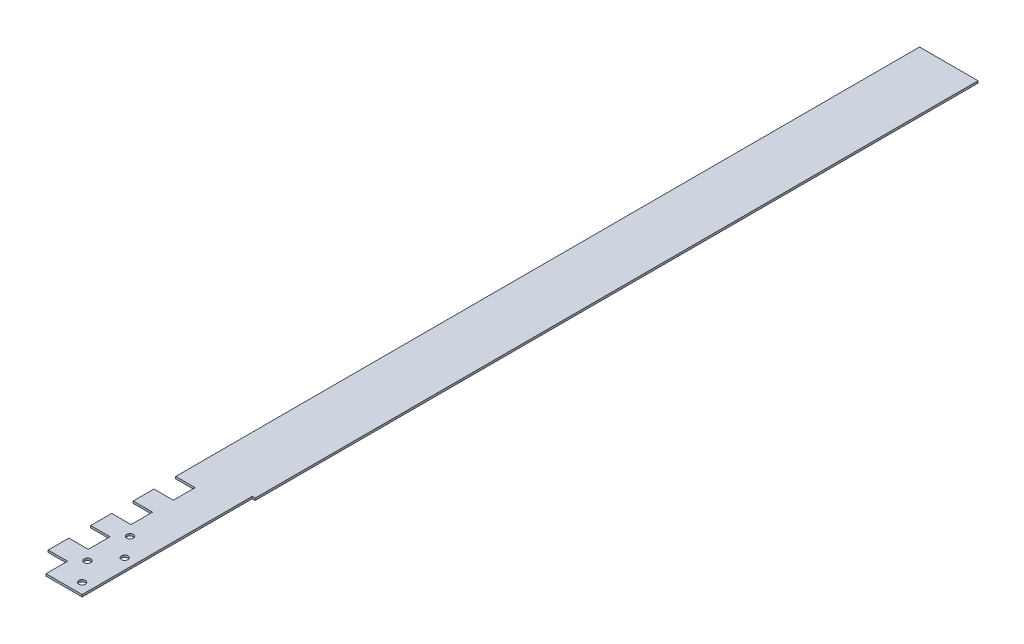
ISO-10303-21;
HEADER;
FILE_DESCRIPTION(('STEP AP214'),'2;1');
FILE_NAME('part.step','',(''),(''),'','','');
FILE_SCHEMA(('AUTOMOTIVE_DESIGN { 1 0 10303 214 1 1 1 1 }'));
ENDSEC;
DATA;
#1=APPLICATION_CONTEXT('core data for automotive mechanical design processes');
#2=APPLICATION_PROTOCOL_DEFINITION('international standard','automotive_design',2000,#1);
#3=PRODUCT_CONTEXT('',#1,'mechanical');
#4=PRODUCT('Part','Part','',(#3));
#5=PRODUCT_RELATED_PRODUCT_CATEGORY('part','',(#4));
#6=PRODUCT_DEFINITION_FORMATION('','',#4);
#7=PRODUCT_DEFINITION_CONTEXT('part definition',#1,'design');
#8=PRODUCT_DEFINITION('design','',#6,#7);
#9=PRODUCT_DEFINITION_SHAPE('','',#8);
#10=(LENGTH_UNIT() NAMED_UNIT(*) SI_UNIT(.MILLI.,.METRE.));
#11=(NAMED_UNIT(*) PLANE_ANGLE_UNIT() SI_UNIT($,.RADIAN.));
#12=(NAMED_UNIT(*) SI_UNIT($,.STERADIAN.) SOLID_ANGLE_UNIT());
#13=UNCERTAINTY_MEASURE_WITH_UNIT(LENGTH_MEASURE(1.E-05),#10,'distance_accuracy_value','');
#14=(GEOMETRIC_REPRESENTATION_CONTEXT(3) GLOBAL_UNCERTAINTY_ASSIGNED_CONTEXT((#13)) GLOBAL_UNIT_ASSIGNED_CONTEXT((#10,
#11,#12)) REPRESENTATION_CONTEXT('',''));
#15=CARTESIAN_POINT('',(0.,0.,0.));
#16=DIRECTION('',(0.,0.,1.));
#17=DIRECTION('',(1.,0.,0.));
#18=AXIS2_PLACEMENT_3D('',#15,#16,#17);
#19=CARTESIAN_POINT('',(-0.280000000000004,-0.999999999999995,170.));
#20=DIRECTION('',(0.,1.,0.));
#21=DIRECTION('',(-1.,0.,0.));
#22=AXIS2_PLACEMENT_3D('',#19,#20,#21);
#23=CYLINDRICAL_SURFACE('',#22,3.09999999999999);
#24=CARTESIAN_POINT('',(-0.280000000000004,-0.999999999999995,170.));
#25=DIRECTION('',(0.,1.,0.));
#26=DIRECTION('',(-1.,0.,0.));
#27=AXIS2_PLACEMENT_3D('',#24,#25,#26);
#28=CIRCLE('',#27,3.09999999999999);
#29=CARTESIAN_POINT('',(-3.37999999999999,-0.999999999999996,170.));
#30=VERTEX_POINT('',#29);
#31=EDGE_CURVE('E274',#30,#30,#28,.T.);
#32=ORIENTED_EDGE('',*,*,#31,.F.);
#33=EDGE_LOOP('',(#32));
#34=FACE_BOUND('',#33,.T.);
#35=CARTESIAN_POINT('',(-0.280000000000005,1.00000000000001,170.));
#36=DIRECTION('',(0.,1.,0.));
#37=DIRECTION('',(-1.,0.,0.));
#38=AXIS2_PLACEMENT_3D('',#35,#36,#37);
#39=CIRCLE('',#38,3.09999999999999);
#40=CARTESIAN_POINT('',(-3.37999999999999,1.,170.));
#41=VERTEX_POINT('',#40);
#42=EDGE_CURVE('E61',#41,#41,#39,.T.);
#43=ORIENTED_EDGE('',*,*,#42,.T.);
#44=EDGE_LOOP('',(#43));
#45=FACE_BOUND('',#44,.T.);
#46=ADVANCED_FACE('F57',(#34,#45),#23,.F.);
#47=CARTESIAN_POINT('',(14.72,-0.999999999999992,190.));
#48=DIRECTION('',(0.,1.,0.));
#49=DIRECTION('',(-1.,0.,0.));
#50=AXIS2_PLACEMENT_3D('',#47,#48,#49);
#51=CYLINDRICAL_SURFACE('',#50,3.09999999999999);
#52=CARTESIAN_POINT('',(14.72,-0.999999999999992,190.));
#53=DIRECTION('',(0.,1.,0.));
#54=DIRECTION('',(-1.,0.,0.));
#55=AXIS2_PLACEMENT_3D('',#52,#53,#54);
#56=CIRCLE('',#55,3.09999999999999);
#57=CARTESIAN_POINT('',(11.62,-0.999999999999993,190.));
#58=VERTEX_POINT('',#57);
#59=EDGE_CURVE('E277',#58,#58,#56,.T.);
#60=ORIENTED_EDGE('',*,*,#59,.F.);
#61=EDGE_LOOP('',(#60));
#62=FACE_BOUND('',#61,.T.);
#63=CARTESIAN_POINT('',(14.72,1.00000000000001,190.));
#64=DIRECTION('',(0.,1.,0.));
#65=DIRECTION('',(-1.,0.,0.));
#66=AXIS2_PLACEMENT_3D('',#63,#64,#65);
#67=CIRCLE('',#66,3.09999999999999);
#68=CARTESIAN_POINT('',(11.62,1.00000000000001,190.));
#69=VERTEX_POINT('',#68);
#70=EDGE_CURVE('E364',#69,#69,#67,.T.);
#71=ORIENTED_EDGE('',*,*,#70,.T.);
#72=EDGE_LOOP('',(#71));
#73=FACE_BOUND('',#72,.T.);
#74=ADVANCED_FACE('F431',(#62,#73),#51,.F.);
#75=CARTESIAN_POINT('',(-0.280000000000006,-0.999999999999995,210.));
#76=DIRECTION('',(0.,1.,0.));
#77=DIRECTION('',(-1.,0.,0.));
#78=AXIS2_PLACEMENT_3D('',#75,#76,#77);
#79=CYLINDRICAL_SURFACE('',#78,3.09999999999999);
#80=CARTESIAN_POINT('',(-0.280000000000006,-0.999999999999995,210.));
#81=DIRECTION('',(0.,1.,0.));
#82=DIRECTION('',(-1.,0.,0.));
#83=AXIS2_PLACEMENT_3D('',#80,#81,#82);
#84=CIRCLE('',#83,3.09999999999999);
#85=CARTESIAN_POINT('',(-3.37999999999999,-0.999999999999996,210.));
#86=VERTEX_POINT('',#85);
#87=EDGE_CURVE('E280',#86,#86,#84,.T.);
#88=ORIENTED_EDGE('',*,*,#87,.F.);
#89=EDGE_LOOP('',(#88));
#90=FACE_BOUND('',#89,.T.);
#91=CARTESIAN_POINT('',(-0.280000000000006,1.00000000000001,210.));
#92=DIRECTION('',(0.,1.,0.));
#93=DIRECTION('',(-1.,0.,0.));
#94=AXIS2_PLACEMENT_3D('',#91,#92,#93);
#95=CIRCLE('',#94,3.09999999999999);
#96=CARTESIAN_POINT('',(-3.37999999999999,1.,210.));
#97=VERTEX_POINT('',#96);
#98=EDGE_CURVE('E362',#97,#97,#95,.T.);
#99=ORIENTED_EDGE('',*,*,#98,.T.);
#100=EDGE_LOOP('',(#99));
#101=FACE_BOUND('',#100,.T.);
#102=ADVANCED_FACE('F437',(#90,#101),#79,.F.);
#103=CARTESIAN_POINT('',(14.72,-0.999999999999992,230.));
#104=DIRECTION('',(0.,1.,0.));
#105=DIRECTION('',(-1.,0.,0.));
#106=AXIS2_PLACEMENT_3D('',#103,#104,#105);
#107=CYLINDRICAL_SURFACE('',#106,3.1);
#108=CARTESIAN_POINT('',(14.72,-0.999999999999992,230.));
#109=DIRECTION('',(0.,1.,0.));
#110=DIRECTION('',(-1.,0.,0.));
#111=AXIS2_PLACEMENT_3D('',#108,#109,#110);
#112=CIRCLE('',#111,3.1);
#113=CARTESIAN_POINT('',(11.62,-0.999999999999993,230.));
#114=VERTEX_POINT('',#113);
#115=EDGE_CURVE('E283',#114,#114,#112,.T.);
#116=ORIENTED_EDGE('',*,*,#115,.F.);
#117=EDGE_LOOP('',(#116));
#118=FACE_BOUND('',#117,.T.);
#119=CARTESIAN_POINT('',(14.72,1.00000000000001,230.));
#120=DIRECTION('',(0.,1.,0.));
#121=DIRECTION('',(-1.,0.,0.));
#122=AXIS2_PLACEMENT_3D('',#119,#120,#121);
#123=CIRCLE('',#122,3.1);
#124=CARTESIAN_POINT('',(11.62,1.00000000000001,230.));
#125=VERTEX_POINT('',#124);
#126=EDGE_CURVE('E359',#125,#125,#123,.T.);
#127=ORIENTED_EDGE('',*,*,#126,.T.);
#128=EDGE_LOOP('',(#127));
#129=FACE_BOUND('',#128,.T.);
#130=ADVANCED_FACE('F446',(#118,#129),#107,.F.);
#131=CARTESIAN_POINT('',(-9.28,-0.999999999999997,219.75));
#132=DIRECTION('',(1.,0.,0.));
#133=DIRECTION('',(0.,1.,0.));
#134=AXIS2_PLACEMENT_3D('',#131,#132,#133);
#135=PLANE('',#134);
#136=DIRECTION('',(0.,0.,-1.));
#137=VECTOR('',#136,1.);
#138=CARTESIAN_POINT('',(-9.28,1.,219.75));
#139=LINE('',#138,#137);
#140=CARTESIAN_POINT('',(-9.28,1.,240.));
#141=VERTEX_POINT('',#140);
#142=CARTESIAN_POINT('',(-9.28,1.,219.75));
#143=VERTEX_POINT('',#142);
#144=EDGE_CURVE('E357',#141,#143,#139,.T.);
#145=ORIENTED_EDGE('',*,*,#144,.T.);
#146=DIRECTION('',(0.,1.,0.));
#147=VECTOR('',#146,1.);
#148=CARTESIAN_POINT('',(-9.28,-0.999999999999997,219.75));
#149=LINE('',#148,#147);
#150=CARTESIAN_POINT('',(-9.28,-0.999999999999997,219.75));
#151=VERTEX_POINT('',#150);
#152=EDGE_CURVE('E180',#151,#143,#149,.T.);
#153=ORIENTED_EDGE('',*,*,#152,.F.);
#154=DIRECTION('',(0.,0.,-1.));
#155=VECTOR('',#154,1.);
#156=CARTESIAN_POINT('',(-9.28,-0.999999999999997,219.75));
#157=LINE('',#156,#155);
#158=CARTESIAN_POINT('',(-9.28,-0.999999999999997,240.));
#159=VERTEX_POINT('',#158);
#160=EDGE_CURVE('E272',#159,#151,#157,.T.);
#161=ORIENTED_EDGE('',*,*,#160,.F.);
#162=DIRECTION('',(0.,1.,0.));
#163=VECTOR('',#162,1.);
#164=CARTESIAN_POINT('',(-9.28,-0.999999999999997,240.));
#165=LINE('',#164,#163);
#166=EDGE_CURVE('E220',#159,#141,#165,.T.);
#167=ORIENTED_EDGE('',*,*,#166,.T.);
#168=EDGE_LOOP('',(#145,#153,#161,#167));
#169=FACE_BOUND('',#168,.T.);
#170=ADVANCED_FACE('F450',(#169),#135,.F.);
#171=CARTESIAN_POINT('',(-27.5,-1.,219.75));
#172=DIRECTION('',(0.,0.,-1.));
#173=DIRECTION('',(-1.,0.,0.));
#174=AXIS2_PLACEMENT_3D('',#171,#172,#173);
#175=PLANE('',#174);
#176=DIRECTION('',(-1.,0.,0.));
#177=VECTOR('',#176,1.);
#178=CARTESIAN_POINT('',(-27.5,1.,219.75));
#179=LINE('',#178,#177);
#180=CARTESIAN_POINT('',(-27.5,1.,219.75));
#181=VERTEX_POINT('',#180);
#182=EDGE_CURVE('E174',#143,#181,#179,.T.);
#183=ORIENTED_EDGE('',*,*,#182,.T.);
#184=DIRECTION('',(0.,1.,0.));
#185=VECTOR('',#184,1.);
#186=CARTESIAN_POINT('',(-27.5,-1.,219.75));
#187=LINE('',#186,#185);
#188=CARTESIAN_POINT('',(-27.5,-1.,219.75));
#189=VERTEX_POINT('',#188);
#190=EDGE_CURVE('E291',#189,#181,#187,.T.);
#191=ORIENTED_EDGE('',*,*,#190,.F.);
#192=DIRECTION('',(-1.,0.,0.));
#193=VECTOR('',#192,1.);
#194=CARTESIAN_POINT('',(-27.5,-1.,219.75));
#195=LINE('',#194,#193);
#196=EDGE_CURVE('E269',#151,#189,#195,.T.);
#197=ORIENTED_EDGE('',*,*,#196,.F.);
#198=ORIENTED_EDGE('',*,*,#152,.T.);
#199=EDGE_LOOP('',(#183,#191,#197,#198));
#200=FACE_BOUND('',#199,.T.);
#201=ADVANCED_FACE('F454',(#200),#175,.F.);
#202=CARTESIAN_POINT('',(-27.5,-1.,560.));
#203=DIRECTION('',(-1.,0.,0.));
#204=DIRECTION('',(0.,0.,1.));
#205=AXIS2_PLACEMENT_3D('',#202,#203,#204);
#206=PLANE('',#205);
#207=ORIENTED_EDGE('',*,*,#190,.T.);
#208=DIRECTION('',(0.,0.,-1.));
#209=VECTOR('',#208,1.);
#210=CARTESIAN_POINT('',(-27.5,1.,560.));
#211=LINE('',#210,#209);
#212=CARTESIAN_POINT('',(-27.5,1.,200.25));
#213=VERTEX_POINT('',#212);
#214=EDGE_CURVE('E288',#181,#213,#211,.T.);
#215=ORIENTED_EDGE('',*,*,#214,.T.);
#216=DIRECTION('',(0.,1.,0.));
#217=VECTOR('',#216,1.);
#218=CARTESIAN_POINT('',(-27.5,-1.,200.25));
#219=LINE('',#218,#217);
#220=CARTESIAN_POINT('',(-27.5,-1.,200.25));
#221=VERTEX_POINT('',#220);
#222=EDGE_CURVE('E348',#221,#213,#219,.T.);
#223=ORIENTED_EDGE('',*,*,#222,.F.);
#224=DIRECTION('',(0.,0.,-1.));
#225=VECTOR('',#224,1.);
#226=CARTESIAN_POINT('',(-27.5,-1.,560.));
#227=LINE('',#226,#225);
#228=EDGE_CURVE('E268',#189,#221,#227,.T.);
#229=ORIENTED_EDGE('',*,*,#228,.F.);
#230=EDGE_LOOP('',(#207,#215,#223,#229));
#231=FACE_BOUND('',#230,.T.);
#232=ADVANCED_FACE('F456',(#231),#206,.T.);
#233=CARTESIAN_POINT('',(-27.5,-1.,200.25));
#234=DIRECTION('',(0.,0.,1.));
#235=DIRECTION('',(1.,0.,0.));
#236=AXIS2_PLACEMENT_3D('',#233,#234,#235);
#237=PLANE('',#236);
#238=DIRECTION('',(1.,0.,0.));
#239=VECTOR('',#238,1.);
#240=CARTESIAN_POINT('',(-27.5,1.,200.25));
#241=LINE('',#240,#239);
#242=CARTESIAN_POINT('',(-9.28,1.,200.25));
#243=VERTEX_POINT('',#242);
#244=EDGE_CURVE('E290',#213,#243,#241,.T.);
#245=ORIENTED_EDGE('',*,*,#244,.T.);
#246=DIRECTION('',(0.,1.,0.));
#247=VECTOR('',#246,1.);
#248=CARTESIAN_POINT('',(-9.28,-0.999999999999997,200.25));
#249=LINE('',#248,#247);
#250=CARTESIAN_POINT('',(-9.28,-0.999999999999997,200.25));
#251=VERTEX_POINT('',#250);
#252=EDGE_CURVE('E343',#251,#243,#249,.T.);
#253=ORIENTED_EDGE('',*,*,#252,.F.);
#254=DIRECTION('',(1.,0.,0.));
#255=VECTOR('',#254,1.);
#256=CARTESIAN_POINT('',(-27.5,-1.,200.25));
#257=LINE('',#256,#255);
#258=EDGE_CURVE('E265',#221,#251,#257,.T.);
#259=ORIENTED_EDGE('',*,*,#258,.F.);
#260=ORIENTED_EDGE('',*,*,#222,.T.);
#261=EDGE_LOOP('',(#245,#253,#259,#260));
#262=FACE_BOUND('',#261,.T.);
#263=ADVANCED_FACE('F459',(#262),#237,.F.);
#264=CARTESIAN_POINT('',(-9.28000000000001,-0.999999999999997,179.75));
#265=DIRECTION('',(1.,0.,0.));
#266=DIRECTION('',(0.,1.,0.));
#267=AXIS2_PLACEMENT_3D('',#264,#265,#266);
#268=PLANE('',#267);
#269=DIRECTION('',(0.,0.,-1.));
#270=VECTOR('',#269,1.);
#271=CARTESIAN_POINT('',(-9.28000000000001,1.,179.75));
#272=LINE('',#271,#270);
#273=CARTESIAN_POINT('',(-9.28000000000001,1.,179.75));
#274=VERTEX_POINT('',#273);
#275=EDGE_CURVE('E345',#243,#274,#272,.T.);
#276=ORIENTED_EDGE('',*,*,#275,.T.);
#277=DIRECTION('',(0.,1.,0.));
#278=VECTOR('',#277,1.);
#279=CARTESIAN_POINT('',(-9.28000000000001,-0.999999999999997,179.75));
#280=LINE('',#279,#278);
#281=CARTESIAN_POINT('',(-9.28000000000001,-0.999999999999997,179.75));
#282=VERTEX_POINT('',#281);
#283=EDGE_CURVE('E339',#282,#274,#280,.T.);
#284=ORIENTED_EDGE('',*,*,#283,.F.);
#285=DIRECTION('',(0.,0.,-1.));
#286=VECTOR('',#285,1.);
#287=CARTESIAN_POINT('',(-9.28000000000001,-0.999999999999997,179.75));
#288=LINE('',#287,#286);
#289=EDGE_CURVE('E262',#251,#282,#288,.T.);
#290=ORIENTED_EDGE('',*,*,#289,.F.);
#291=ORIENTED_EDGE('',*,*,#252,.T.);
#292=EDGE_LOOP('',(#276,#284,#290,#291));
#293=FACE_BOUND('',#292,.T.);
#294=ADVANCED_FACE('F463',(#293),#268,.F.);
#295=CARTESIAN_POINT('',(-27.5,-1.,179.75));
#296=DIRECTION('',(0.,0.,-1.));
#297=DIRECTION('',(-1.,0.,0.));
#298=AXIS2_PLACEMENT_3D('',#295,#296,#297);
#299=PLANE('',#298);
#300=DIRECTION('',(-1.,0.,0.));
#301=VECTOR('',#300,1.);
#302=CARTESIAN_POINT('',(-27.5,1.,179.75));
#303=LINE('',#302,#301);
#304=CARTESIAN_POINT('',(-27.5,1.,179.75));
#305=VERTEX_POINT('',#304);
#306=EDGE_CURVE('E341',#274,#305,#303,.T.);
#307=ORIENTED_EDGE('',*,*,#306,.T.);
#308=DIRECTION('',(0.,1.,0.));
#309=VECTOR('',#308,1.);
#310=CARTESIAN_POINT('',(-27.5,-1.,179.75));
#311=LINE('',#310,#309);
#312=CARTESIAN_POINT('',(-27.5,-1.,179.75));
#313=VERTEX_POINT('',#312);
#314=EDGE_CURVE('E336',#313,#305,#311,.T.);
#315=ORIENTED_EDGE('',*,*,#314,.F.);
#316=DIRECTION('',(-1.,0.,0.));
#317=VECTOR('',#316,1.);
#318=CARTESIAN_POINT('',(-27.5,-1.,179.75));
#319=LINE('',#318,#317);
#320=EDGE_CURVE('E260',#282,#313,#319,.T.);
#321=ORIENTED_EDGE('',*,*,#320,.F.);
#322=ORIENTED_EDGE('',*,*,#283,.T.);
#323=EDGE_LOOP('',(#307,#315,#321,#322));
#324=FACE_BOUND('',#323,.T.);
#325=ADVANCED_FACE('F467',(#324),#299,.F.);
#326=ORIENTED_EDGE('',*,*,#314,.T.);
#327=CARTESIAN_POINT('',(-27.5,1.,160.));
#328=VERTEX_POINT('',#327);
#329=EDGE_CURVE('E292',#305,#328,#211,.T.);
#330=ORIENTED_EDGE('',*,*,#329,.T.);
#331=DIRECTION('',(0.,1.,0.));
#332=VECTOR('',#331,1.);
#333=CARTESIAN_POINT('',(-27.5,-1.,160.));
#334=LINE('',#333,#332);
#335=CARTESIAN_POINT('',(-27.5,-1.,160.));
#336=VERTEX_POINT('',#335);
#337=EDGE_CURVE('E330',#336,#328,#334,.T.);
#338=ORIENTED_EDGE('',*,*,#337,.F.);
#339=EDGE_CURVE('E76',#313,#336,#227,.T.);
#340=ORIENTED_EDGE('',*,*,#339,.F.);
#341=EDGE_LOOP('',(#326,#330,#338,#340));
#342=FACE_BOUND('',#341,.T.);
#343=ADVANCED_FACE('F410',(#342),#206,.T.);
#344=CARTESIAN_POINT('',(-27.5,-1.,160.));
#345=DIRECTION('',(0.,0.,1.));
#346=DIRECTION('',(1.,0.,0.));
#347=AXIS2_PLACEMENT_3D('',#344,#345,#346);
#348=PLANE('',#347);
#349=DIRECTION('',(1.,0.,0.));
#350=VECTOR('',#349,1.);
#351=CARTESIAN_POINT('',(-27.5,1.,160.));
#352=LINE('',#351,#350);
#353=CARTESIAN_POINT('',(-9.28,1.,160.));
#354=VERTEX_POINT('',#353);
#355=EDGE_CURVE('E333',#328,#354,#352,.T.);
#356=ORIENTED_EDGE('',*,*,#355,.T.);
#357=DIRECTION('',(0.,1.,0.));
#358=VECTOR('',#357,1.);
#359=CARTESIAN_POINT('',(-9.28,-0.999999999999997,160.));
#360=LINE('',#359,#358);
#361=CARTESIAN_POINT('',(-9.28,-0.999999999999997,160.));
#362=VERTEX_POINT('',#361);
#363=EDGE_CURVE('E325',#362,#354,#360,.T.);
#364=ORIENTED_EDGE('',*,*,#363,.F.);
#365=DIRECTION('',(1.,0.,0.));
#366=VECTOR('',#365,1.);
#367=CARTESIAN_POINT('',(-27.5,-1.,160.));
#368=LINE('',#367,#366);
#369=EDGE_CURVE('E258',#336,#362,#368,.T.);
#370=ORIENTED_EDGE('',*,*,#369,.F.);
#371=ORIENTED_EDGE('',*,*,#337,.T.);
#372=EDGE_LOOP('',(#356,#364,#370,#371));
#373=FACE_BOUND('',#372,.T.);
#374=ADVANCED_FACE('F414',(#373),#348,.F.);
#375=CARTESIAN_POINT('',(-9.28,-0.999999999999997,139.75));
#376=DIRECTION('',(1.,0.,0.));
#377=DIRECTION('',(0.,1.,0.));
#378=AXIS2_PLACEMENT_3D('',#375,#376,#377);
#379=PLANE('',#378);
#380=DIRECTION('',(0.,0.,-1.));
#381=VECTOR('',#380,1.);
#382=CARTESIAN_POINT('',(-9.28,1.,139.75));
#383=LINE('',#382,#381);
#384=CARTESIAN_POINT('',(-9.28,1.,139.75));
#385=VERTEX_POINT('',#384);
#386=EDGE_CURVE('E327',#354,#385,#383,.T.);
#387=ORIENTED_EDGE('',*,*,#386,.T.);
#388=DIRECTION('',(0.,1.,0.));
#389=VECTOR('',#388,1.);
#390=CARTESIAN_POINT('',(-9.28,-0.999999999999997,139.75));
#391=LINE('',#390,#389);
#392=CARTESIAN_POINT('',(-9.28,-0.999999999999997,139.75));
#393=VERTEX_POINT('',#392);
#394=EDGE_CURVE('E321',#393,#385,#391,.T.);
#395=ORIENTED_EDGE('',*,*,#394,.F.);
#396=DIRECTION('',(0.,0.,-1.));
#397=VECTOR('',#396,1.);
#398=CARTESIAN_POINT('',(-9.28,-0.999999999999997,139.75));
#399=LINE('',#398,#397);
#400=EDGE_CURVE('E255',#362,#393,#399,.T.);
#401=ORIENTED_EDGE('',*,*,#400,.F.);
#402=ORIENTED_EDGE('',*,*,#363,.T.);
#403=EDGE_LOOP('',(#387,#395,#401,#402));
#404=FACE_BOUND('',#403,.T.);
#405=ADVANCED_FACE('F417',(#404),#379,.F.);
#406=CARTESIAN_POINT('',(-27.5,-1.,139.75));
#407=DIRECTION('',(0.,0.,-1.));
#408=DIRECTION('',(-1.,0.,0.));
#409=AXIS2_PLACEMENT_3D('',#406,#407,#408);
#410=PLANE('',#409);
#411=DIRECTION('',(-1.,0.,0.));
#412=VECTOR('',#411,1.);
#413=CARTESIAN_POINT('',(-27.5,1.,139.75));
#414=LINE('',#413,#412);
#415=CARTESIAN_POINT('',(-27.5,1.,139.75));
#416=VERTEX_POINT('',#415);
#417=EDGE_CURVE('E323',#385,#416,#414,.T.);
#418=ORIENTED_EDGE('',*,*,#417,.T.);
#419=DIRECTION('',(0.,1.,0.));
#420=VECTOR('',#419,1.);
#421=CARTESIAN_POINT('',(-27.5,-1.,139.75));
#422=LINE('',#421,#420);
#423=CARTESIAN_POINT('',(-27.5,-1.,139.75));
#424=VERTEX_POINT('',#423);
#425=EDGE_CURVE('E318',#424,#416,#422,.T.);
#426=ORIENTED_EDGE('',*,*,#425,.F.);
#427=DIRECTION('',(-1.,0.,0.));
#428=VECTOR('',#427,1.);
#429=CARTESIAN_POINT('',(-27.5,-1.,139.75));
#430=LINE('',#429,#428);
#431=EDGE_CURVE('E252',#393,#424,#430,.T.);
#432=ORIENTED_EDGE('',*,*,#431,.F.);
#433=ORIENTED_EDGE('',*,*,#394,.T.);
#434=EDGE_LOOP('',(#418,#426,#432,#433));
#435=FACE_BOUND('',#434,.T.);
#436=ADVANCED_FACE('F420',(#435),#410,.F.);
#437=ORIENTED_EDGE('',*,*,#425,.T.);
#438=CARTESIAN_POINT('',(-27.5,1.,120.25));
#439=VERTEX_POINT('',#438);
#440=EDGE_CURVE('E293',#416,#439,#211,.T.);
#441=ORIENTED_EDGE('',*,*,#440,.T.);
#442=DIRECTION('',(0.,1.,0.));
#443=VECTOR('',#442,1.);
#444=CARTESIAN_POINT('',(-27.5,-1.,120.25));
#445=LINE('',#444,#443);
#446=CARTESIAN_POINT('',(-27.5,-1.,120.25));
#447=VERTEX_POINT('',#446);
#448=EDGE_CURVE('E313',#447,#439,#445,.T.);
#449=ORIENTED_EDGE('',*,*,#448,.F.);
#450=EDGE_CURVE('E242',#424,#447,#227,.T.);
#451=ORIENTED_EDGE('',*,*,#450,.F.);
#452=EDGE_LOOP('',(#437,#441,#449,#451));
#453=FACE_BOUND('',#452,.T.);
#454=ADVANCED_FACE('F387',(#453),#206,.T.);
#455=CARTESIAN_POINT('',(-27.5,-1.,120.25));
#456=DIRECTION('',(0.,0.,1.));
#457=DIRECTION('',(1.,0.,0.));
#458=AXIS2_PLACEMENT_3D('',#455,#456,#457);
#459=PLANE('',#458);
#460=DIRECTION('',(1.,0.,0.));
#461=VECTOR('',#460,1.);
#462=CARTESIAN_POINT('',(-27.5,1.,120.25));
#463=LINE('',#462,#461);
#464=CARTESIAN_POINT('',(-9.28,1.,120.25));
#465=VERTEX_POINT('',#464);
#466=EDGE_CURVE('E315',#439,#465,#463,.T.);
#467=ORIENTED_EDGE('',*,*,#466,.T.);
#468=DIRECTION('',(0.,1.,0.));
#469=VECTOR('',#468,1.);
#470=CARTESIAN_POINT('',(-9.28,-0.999999999999997,120.25));
#471=LINE('',#470,#469);
#472=CARTESIAN_POINT('',(-9.28,-0.999999999999997,120.25));
#473=VERTEX_POINT('',#472);
#474=EDGE_CURVE('E308',#473,#465,#471,.T.);
#475=ORIENTED_EDGE('',*,*,#474,.F.);
#476=DIRECTION('',(1.,0.,0.));
#477=VECTOR('',#476,1.);
#478=CARTESIAN_POINT('',(-27.5,-1.,120.25));
#479=LINE('',#478,#477);
#480=EDGE_CURVE('E249',#447,#473,#479,.T.);
#481=ORIENTED_EDGE('',*,*,#480,.F.);
#482=ORIENTED_EDGE('',*,*,#448,.T.);
#483=EDGE_LOOP('',(#467,#475,#481,#482));
#484=FACE_BOUND('',#483,.T.);
#485=ADVANCED_FACE('F392',(#484),#459,.F.);
#486=CARTESIAN_POINT('',(-9.28000000000001,-0.999999999999997,99.75));
#487=DIRECTION('',(1.,0.,0.));
#488=DIRECTION('',(0.,1.,0.));
#489=AXIS2_PLACEMENT_3D('',#486,#487,#488);
#490=PLANE('',#489);
#491=DIRECTION('',(0.,0.,-1.));
#492=VECTOR('',#491,1.);
#493=CARTESIAN_POINT('',(-9.28000000000001,1.,99.75));
#494=LINE('',#493,#492);
#495=CARTESIAN_POINT('',(-9.28000000000001,1.,99.75));
#496=VERTEX_POINT('',#495);
#497=EDGE_CURVE('E310',#465,#496,#494,.T.);
#498=ORIENTED_EDGE('',*,*,#497,.T.);
#499=DIRECTION('',(0.,1.,0.));
#500=VECTOR('',#499,1.);
#501=CARTESIAN_POINT('',(-9.28000000000001,-0.999999999999997,99.75));
#502=LINE('',#501,#500);
#503=CARTESIAN_POINT('',(-9.28000000000001,-0.999999999999997,99.75));
#504=VERTEX_POINT('',#503);
#505=EDGE_CURVE('E304',#504,#496,#502,.T.);
#506=ORIENTED_EDGE('',*,*,#505,.F.);
#507=DIRECTION('',(0.,0.,-1.));
#508=VECTOR('',#507,1.);
#509=CARTESIAN_POINT('',(-9.28000000000001,-0.999999999999997,99.75));
#510=LINE('',#509,#508);
#511=EDGE_CURVE('E246',#473,#504,#510,.T.);
#512=ORIENTED_EDGE('',*,*,#511,.F.);
#513=ORIENTED_EDGE('',*,*,#474,.T.);
#514=EDGE_LOOP('',(#498,#506,#512,#513));
#515=FACE_BOUND('',#514,.T.);
#516=ADVANCED_FACE('F399',(#515),#490,.F.);
#517=CARTESIAN_POINT('',(-27.5,-1.,99.75));
#518=DIRECTION('',(0.,0.,-1.));
#519=DIRECTION('',(-1.,0.,0.));
#520=AXIS2_PLACEMENT_3D('',#517,#518,#519);
#521=PLANE('',#520);
#522=DIRECTION('',(-1.,0.,0.));
#523=VECTOR('',#522,1.);
#524=CARTESIAN_POINT('',(-27.5,1.,99.75));
#525=LINE('',#524,#523);
#526=CARTESIAN_POINT('',(-27.5,1.,99.75));
#527=VERTEX_POINT('',#526);
#528=EDGE_CURVE('E306',#496,#527,#525,.T.);
#529=ORIENTED_EDGE('',*,*,#528,.T.);
#530=DIRECTION('',(0.,1.,0.));
#531=VECTOR('',#530,1.);
#532=CARTESIAN_POINT('',(-27.5,-1.,99.75));
#533=LINE('',#532,#531);
#534=CARTESIAN_POINT('',(-27.5,-1.,99.75));
#535=VERTEX_POINT('',#534);
#536=EDGE_CURVE('E302',#535,#527,#533,.T.);
#537=ORIENTED_EDGE('',*,*,#536,.F.);
#538=DIRECTION('',(-1.,0.,0.));
#539=VECTOR('',#538,1.);
#540=CARTESIAN_POINT('',(-27.5,-1.,99.75));
#541=LINE('',#540,#539);
#542=EDGE_CURVE('E240',#504,#535,#541,.T.);
#543=ORIENTED_EDGE('',*,*,#542,.F.);
#544=ORIENTED_EDGE('',*,*,#505,.T.);
#545=EDGE_LOOP('',(#529,#537,#543,#544));
#546=FACE_BOUND('',#545,.T.);
#547=ADVANCED_FACE('F591',(#546),#521,.F.);
#548=ORIENTED_EDGE('',*,*,#536,.T.);
#549=CARTESIAN_POINT('',(-27.5,1.,-600.));
#550=VERTEX_POINT('',#549);
#551=EDGE_CURVE('E196',#527,#550,#211,.T.);
#552=ORIENTED_EDGE('',*,*,#551,.T.);
#553=DIRECTION('',(0.,1.,0.));
#554=VECTOR('',#553,1.);
#555=CARTESIAN_POINT('',(-27.5,-1.,-600.));
#556=LINE('',#555,#554);
#557=CARTESIAN_POINT('',(-27.5,-1.,-600.));
#558=VERTEX_POINT('',#557);
#559=EDGE_CURVE('E372',#558,#550,#556,.T.);
#560=ORIENTED_EDGE('',*,*,#559,.F.);
#561=EDGE_CURVE('E238',#535,#558,#227,.T.);
#562=ORIENTED_EDGE('',*,*,#561,.F.);
#563=EDGE_LOOP('',(#548,#552,#560,#562));
#564=FACE_BOUND('',#563,.T.);
#565=ADVANCED_FACE('F405',(#564),#206,.T.);
#566=CARTESIAN_POINT('',(27.5,1.00000000000001,560.));
#567=DIRECTION('',(1.,0.,0.));
#568=DIRECTION('',(0.,0.,-1.));
#569=AXIS2_PLACEMENT_3D('',#566,#567,#568);
#570=PLANE('',#569);
#571=DIRECTION('',(0.,1.,0.));
#572=VECTOR('',#571,1.);
#573=CARTESIAN_POINT('',(27.5,-0.99999999999999,80.));
#574=LINE('',#573,#572);
#575=CARTESIAN_POINT('',(27.5,-0.99999999999999,80.));
#576=VERTEX_POINT('',#575);
#577=CARTESIAN_POINT('',(27.5,1.00000000000001,80.));
#578=VERTEX_POINT('',#577);
#579=EDGE_CURVE('E296',#576,#578,#574,.T.);
#580=ORIENTED_EDGE('',*,*,#579,.F.);
#581=DIRECTION('',(0.,0.,-1.));
#582=VECTOR('',#581,1.);
#583=CARTESIAN_POINT('',(27.5,-0.99999999999999,560.));
#584=LINE('',#583,#582);
#585=CARTESIAN_POINT('',(27.5,-0.99999999999999,-600.));
#586=VERTEX_POINT('',#585);
#587=EDGE_CURVE('E235',#576,#586,#584,.T.);
#588=ORIENTED_EDGE('',*,*,#587,.T.);
#589=DIRECTION('',(0.,-1.,0.));
#590=VECTOR('',#589,1.);
#591=CARTESIAN_POINT('',(27.5,1.00000000000001,-600.));
#592=LINE('',#591,#590);
#593=CARTESIAN_POINT('',(27.5,1.00000000000001,-600.));
#594=VERTEX_POINT('',#593);
#595=EDGE_CURVE('E231',#594,#586,#592,.T.);
#596=ORIENTED_EDGE('',*,*,#595,.F.);
#597=DIRECTION('',(0.,0.,-1.));
#598=VECTOR('',#597,1.);
#599=CARTESIAN_POINT('',(27.5,1.00000000000001,560.));
#600=LINE('',#599,#598);
#601=EDGE_CURVE('E188',#578,#594,#600,.T.);
#602=ORIENTED_EDGE('',*,*,#601,.F.);
#603=EDGE_LOOP('',(#580,#588,#596,#602));
#604=FACE_BOUND('',#603,.T.);
#605=ADVANCED_FACE('F610',(#604),#570,.T.);
#606=CARTESIAN_POINT('',(27.5,-0.99999999999999,80.));
#607=DIRECTION('',(0.,0.,-1.));
#608=DIRECTION('',(-1.,0.,0.));
#609=AXIS2_PLACEMENT_3D('',#606,#607,#608);
#610=PLANE('',#609);
#611=DIRECTION('',(-1.,0.,0.));
#612=VECTOR('',#611,1.);
#613=CARTESIAN_POINT('',(27.5,1.00000000000001,80.));
#614=LINE('',#613,#612);
#615=CARTESIAN_POINT('',(24.72,1.00000000000001,80.));
#616=VERTEX_POINT('',#615);
#617=EDGE_CURVE('E298',#578,#616,#614,.T.);
#618=ORIENTED_EDGE('',*,*,#617,.T.);
#619=DIRECTION('',(0.,1.,0.));
#620=VECTOR('',#619,1.);
#621=CARTESIAN_POINT('',(24.72,-0.99999999999999,80.));
#622=LINE('',#621,#620);
#623=CARTESIAN_POINT('',(24.72,-0.99999999999999,80.));
#624=VERTEX_POINT('',#623);
#625=EDGE_CURVE('E287',#624,#616,#622,.T.);
#626=ORIENTED_EDGE('',*,*,#625,.F.);
#627=DIRECTION('',(-1.,0.,0.));
#628=VECTOR('',#627,1.);
#629=CARTESIAN_POINT('',(27.5,-0.99999999999999,80.));
#630=LINE('',#629,#628);
#631=EDGE_CURVE('E67',#576,#624,#630,.T.);
#632=ORIENTED_EDGE('',*,*,#631,.F.);
#633=ORIENTED_EDGE('',*,*,#579,.T.);
#634=EDGE_LOOP('',(#618,#626,#632,#633));
#635=FACE_BOUND('',#634,.T.);
#636=ADVANCED_FACE('F620',(#635),#610,.F.);
#637=CARTESIAN_POINT('',(24.72,-0.99999999999999,160.));
#638=DIRECTION('',(-1.,0.,0.));
#639=DIRECTION('',(0.,-1.,0.));
#640=AXIS2_PLACEMENT_3D('',#637,#638,#639);
#641=PLANE('',#640);
#642=DIRECTION('',(0.,0.,1.));
#643=VECTOR('',#642,1.);
#644=CARTESIAN_POINT('',(24.72,1.00000000000001,160.));
#645=LINE('',#644,#643);
#646=CARTESIAN_POINT('',(24.72,1.00000000000001,240.));
#647=VERTEX_POINT('',#646);
#648=EDGE_CURVE('E230',#616,#647,#645,.T.);
#649=ORIENTED_EDGE('',*,*,#648,.T.);
#650=DIRECTION('',(0.,-1.,0.));
#651=VECTOR('',#650,1.);
#652=CARTESIAN_POINT('',(24.72,-0.99999999999999,240.));
#653=LINE('',#652,#651);
#654=CARTESIAN_POINT('',(24.72,-0.99999999999999,240.));
#655=VERTEX_POINT('',#654);
#656=EDGE_CURVE('E217',#647,#655,#653,.T.);
#657=ORIENTED_EDGE('',*,*,#656,.T.);
#658=DIRECTION('',(0.,0.,1.));
#659=VECTOR('',#658,1.);
#660=CARTESIAN_POINT('',(24.72,-0.99999999999999,160.));
#661=LINE('',#660,#659);
#662=EDGE_CURVE('E12',#624,#655,#661,.T.);
#663=ORIENTED_EDGE('',*,*,#662,.F.);
#664=ORIENTED_EDGE('',*,*,#625,.T.);
#665=EDGE_LOOP('',(#649,#657,#663,#664));
#666=FACE_BOUND('',#665,.T.);
#667=ADVANCED_FACE('F227',(#666),#641,.F.);
#668=CARTESIAN_POINT('',(-27.5,1.,560.));
#669=DIRECTION('',(0.,1.,0.));
#670=DIRECTION('',(-1.,0.,0.));
#671=AXIS2_PLACEMENT_3D('',#668,#669,#670);
#672=PLANE('',#671);
#673=DIRECTION('',(-1.,0.,0.));
#674=VECTOR('',#673,1.);
#675=CARTESIAN_POINT('',(-27.5,1.,240.));
#676=LINE('',#675,#674);
#677=EDGE_CURVE('E222',#647,#141,#676,.T.);
#678=ORIENTED_EDGE('',*,*,#677,.F.);
#679=ORIENTED_EDGE('',*,*,#648,.F.);
#680=ORIENTED_EDGE('',*,*,#617,.F.);
#681=ORIENTED_EDGE('',*,*,#601,.T.);
#682=DIRECTION('',(1.,0.,0.));
#683=VECTOR('',#682,1.);
#684=CARTESIAN_POINT('',(-27.5,1.,-600.));
#685=LINE('',#684,#683);
#686=EDGE_CURVE('E369',#550,#594,#685,.T.);
#687=ORIENTED_EDGE('',*,*,#686,.F.);
#688=ORIENTED_EDGE('',*,*,#551,.F.);
#689=ORIENTED_EDGE('',*,*,#528,.F.);
#690=ORIENTED_EDGE('',*,*,#497,.F.);
#691=ORIENTED_EDGE('',*,*,#466,.F.);
#692=ORIENTED_EDGE('',*,*,#440,.F.);
#693=ORIENTED_EDGE('',*,*,#417,.F.);
#694=ORIENTED_EDGE('',*,*,#386,.F.);
#695=ORIENTED_EDGE('',*,*,#355,.F.);
#696=ORIENTED_EDGE('',*,*,#329,.F.);
#697=ORIENTED_EDGE('',*,*,#306,.F.);
#698=ORIENTED_EDGE('',*,*,#275,.F.);
#699=ORIENTED_EDGE('',*,*,#244,.F.);
#700=ORIENTED_EDGE('',*,*,#214,.F.);
#701=ORIENTED_EDGE('',*,*,#182,.F.);
#702=ORIENTED_EDGE('',*,*,#144,.F.);
#703=EDGE_LOOP('',(#678,#679,#680,#681,#687,#688,#689,#690,#691,#692,#693,#694,#695,#696,#697,
#698,#699,#700,#701,#702));
#704=FACE_BOUND('',#703,.T.);
#705=ORIENTED_EDGE('',*,*,#126,.F.);
#706=EDGE_LOOP('',(#705));
#707=FACE_BOUND('',#706,.T.);
#708=ORIENTED_EDGE('',*,*,#98,.F.);
#709=EDGE_LOOP('',(#708));
#710=FACE_BOUND('',#709,.T.);
#711=ORIENTED_EDGE('',*,*,#70,.F.);
#712=EDGE_LOOP('',(#711));
#713=FACE_BOUND('',#712,.T.);
#714=ORIENTED_EDGE('',*,*,#42,.F.);
#715=EDGE_LOOP('',(#714));
#716=FACE_BOUND('',#715,.T.);
#717=ADVANCED_FACE('F394',(#704,#707,#710,#713,#716),#672,.T.);
#718=CARTESIAN_POINT('',(-27.5,-1.,560.));
#719=DIRECTION('',(0.,1.,0.));
#720=DIRECTION('',(-1.,0.,0.));
#721=AXIS2_PLACEMENT_3D('',#718,#719,#720);
#722=PLANE('',#721);
#723=ORIENTED_EDGE('',*,*,#115,.T.);
#724=EDGE_LOOP('',(#723));
#725=FACE_BOUND('',#724,.T.);
#726=ORIENTED_EDGE('',*,*,#87,.T.);
#727=EDGE_LOOP('',(#726));
#728=FACE_BOUND('',#727,.T.);
#729=ORIENTED_EDGE('',*,*,#59,.T.);
#730=EDGE_LOOP('',(#729));
#731=FACE_BOUND('',#730,.T.);
#732=ORIENTED_EDGE('',*,*,#31,.T.);
#733=EDGE_LOOP('',(#732));
#734=FACE_BOUND('',#733,.T.);
#735=ORIENTED_EDGE('',*,*,#662,.T.);
#736=DIRECTION('',(1.,0.,0.));
#737=VECTOR('',#736,1.);
#738=CARTESIAN_POINT('',(27.5,-0.99999999999999,240.));
#739=LINE('',#738,#737);
#740=EDGE_CURVE('E214',#159,#655,#739,.T.);
#741=ORIENTED_EDGE('',*,*,#740,.F.);
#742=ORIENTED_EDGE('',*,*,#160,.T.);
#743=ORIENTED_EDGE('',*,*,#196,.T.);
#744=ORIENTED_EDGE('',*,*,#228,.T.);
#745=ORIENTED_EDGE('',*,*,#258,.T.);
#746=ORIENTED_EDGE('',*,*,#289,.T.);
#747=ORIENTED_EDGE('',*,*,#320,.T.);
#748=ORIENTED_EDGE('',*,*,#339,.T.);
#749=ORIENTED_EDGE('',*,*,#369,.T.);
#750=ORIENTED_EDGE('',*,*,#400,.T.);
#751=ORIENTED_EDGE('',*,*,#431,.T.);
#752=ORIENTED_EDGE('',*,*,#450,.T.);
#753=ORIENTED_EDGE('',*,*,#480,.T.);
#754=ORIENTED_EDGE('',*,*,#511,.T.);
#755=ORIENTED_EDGE('',*,*,#542,.T.);
#756=ORIENTED_EDGE('',*,*,#561,.T.);
#757=DIRECTION('',(-1.,0.,0.));
#758=VECTOR('',#757,1.);
#759=CARTESIAN_POINT('',(27.5,-0.99999999999999,-600.));
#760=LINE('',#759,#758);
#761=EDGE_CURVE('E377',#586,#558,#760,.T.);
#762=ORIENTED_EDGE('',*,*,#761,.F.);
#763=ORIENTED_EDGE('',*,*,#587,.F.);
#764=ORIENTED_EDGE('',*,*,#631,.T.);
#765=EDGE_LOOP('',(#735,#741,#742,#743,#744,#745,#746,#747,#748,#749,#750,#751,#752,#753,#754,
#755,#756,#762,#763,#764));
#766=FACE_BOUND('',#765,.T.);
#767=ADVANCED_FACE('F59',(#725,#728,#731,#734,#766),#722,.F.);
#768=CARTESIAN_POINT('',(0.,0.,-600.));
#769=DIRECTION('',(0.,0.,-1.));
#770=DIRECTION('',(-1.,0.,0.));
#771=AXIS2_PLACEMENT_3D('',#768,#769,#770);
#772=PLANE('',#771);
#773=ORIENTED_EDGE('',*,*,#595,.T.);
#774=ORIENTED_EDGE('',*,*,#761,.T.);
#775=ORIENTED_EDGE('',*,*,#559,.T.);
#776=ORIENTED_EDGE('',*,*,#686,.T.);
#777=EDGE_LOOP('',(#773,#774,#775,#776));
#778=FACE_BOUND('',#777,.T.);
#779=ADVANCED_FACE('F406',(#778),#772,.T.);
#780=CARTESIAN_POINT('',(27.5,11.9211202345139,240.));
#781=DIRECTION('',(0.,0.,-1.));
#782=DIRECTION('',(-1.,0.,0.));
#783=AXIS2_PLACEMENT_3D('',#780,#781,#782);
#784=PLANE('',#783);
#785=ORIENTED_EDGE('',*,*,#740,.T.);
#786=ORIENTED_EDGE('',*,*,#656,.F.);
#787=ORIENTED_EDGE('',*,*,#677,.T.);
#788=ORIENTED_EDGE('',*,*,#166,.F.);
#789=EDGE_LOOP('',(#785,#786,#787,#788));
#790=FACE_BOUND('',#789,.T.);
#791=ADVANCED_FACE('F216',(#790),#784,.F.);
#792=CLOSED_SHELL('',(#46,#74,#102,#130,#170,#201,#232,#263,#294,#325,#343,#374,#405,#436,#454,
#485,#516,#547,#565,#605,#636,#667,#717,#767,#779,#791));
#793=MANIFOLD_SOLID_BREP('B2',#792);
#794=ADVANCED_BREP_SHAPE_REPRESENTATION('',(#18,#793),#14);
#795=SHAPE_DEFINITION_REPRESENTATION(#9,#794);
ENDSEC;
END-ISO-10303-21;
